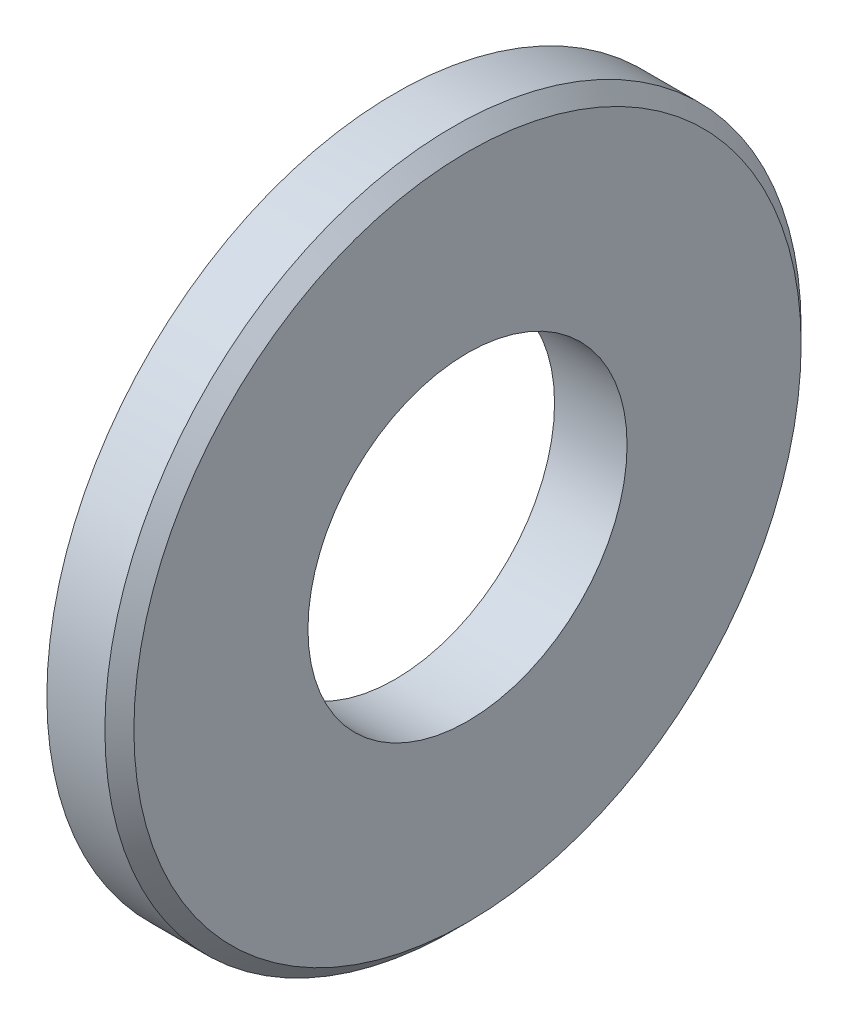
ISO-10303-21;
HEADER;
FILE_DESCRIPTION(('STEP AP214'),'2;1');
FILE_NAME('part.step','',(''),(''),'','','');
FILE_SCHEMA(('AUTOMOTIVE_DESIGN { 1 0 10303 214 1 1 1 1 }'));
ENDSEC;
DATA;
#1=APPLICATION_CONTEXT('core data for automotive mechanical design processes');
#2=APPLICATION_PROTOCOL_DEFINITION('international standard','automotive_design',2000,#1);
#3=PRODUCT_CONTEXT('',#1,'mechanical');
#4=PRODUCT('Part','Part','',(#3));
#5=PRODUCT_RELATED_PRODUCT_CATEGORY('part','',(#4));
#6=PRODUCT_DEFINITION_FORMATION('','',#4);
#7=PRODUCT_DEFINITION_CONTEXT('part definition',#1,'design');
#8=PRODUCT_DEFINITION('design','',#6,#7);
#9=PRODUCT_DEFINITION_SHAPE('','',#8);
#10=(LENGTH_UNIT() NAMED_UNIT(*) SI_UNIT(.MILLI.,.METRE.));
#11=(NAMED_UNIT(*) PLANE_ANGLE_UNIT() SI_UNIT($,.RADIAN.));
#12=(NAMED_UNIT(*) SI_UNIT($,.STERADIAN.) SOLID_ANGLE_UNIT());
#13=UNCERTAINTY_MEASURE_WITH_UNIT(LENGTH_MEASURE(1.E-05),#10,'distance_accuracy_value','');
#14=(GEOMETRIC_REPRESENTATION_CONTEXT(3) GLOBAL_UNCERTAINTY_ASSIGNED_CONTEXT((#13)) GLOBAL_UNIT_ASSIGNED_CONTEXT((#10,
#11,#12)) REPRESENTATION_CONTEXT('',''));
#15=CARTESIAN_POINT('',(0.,0.,0.));
#16=DIRECTION('',(0.,0.,1.));
#17=DIRECTION('',(1.,0.,0.));
#18=AXIS2_PLACEMENT_3D('',#15,#16,#17);
#19=CARTESIAN_POINT('',(2.,12.,0.));
#20=DIRECTION('',(1.,0.,0.));
#21=DIRECTION('',(0.,0.,-1.));
#22=AXIS2_PLACEMENT_3D('',#19,#20,#21);
#23=PLANE('',#22);
#24=CARTESIAN_POINT('',(2.,0.,0.));
#25=DIRECTION('',(-1.,0.,0.));
#26=DIRECTION('',(0.,0.,1.));
#27=AXIS2_PLACEMENT_3D('',#24,#25,#26);
#28=CIRCLE('',#27,12.);
#29=CARTESIAN_POINT('',(2.,0.,12.));
#30=VERTEX_POINT('',#29);
#31=EDGE_CURVE('E38',#30,#30,#28,.F.);
#32=ORIENTED_EDGE('',*,*,#31,.F.);
#33=EDGE_LOOP('',(#32));
#34=FACE_BOUND('',#33,.T.);
#35=CARTESIAN_POINT('',(2.,0.,0.));
#36=DIRECTION('',(-1.,0.,0.));
#37=DIRECTION('',(0.,0.,1.));
#38=AXIS2_PLACEMENT_3D('',#35,#36,#37);
#39=CIRCLE('',#38,10.25);
#40=CARTESIAN_POINT('',(2.,0.,10.25));
#41=VERTEX_POINT('',#40);
#42=EDGE_CURVE('E18',#41,#41,#39,.F.);
#43=ORIENTED_EDGE('',*,*,#42,.T.);
#44=EDGE_LOOP('',(#43));
#45=FACE_BOUND('',#44,.T.);
#46=ADVANCED_FACE('F15',(#34,#45),#23,.F.);
#47=CARTESIAN_POINT('',(0.,0.,0.));
#48=DIRECTION('',(-1.,0.,0.));
#49=DIRECTION('',(0.,0.,1.));
#50=AXIS2_PLACEMENT_3D('',#47,#48,#49);
#51=TOROIDAL_SURFACE('',#50,8.75,2.5);
#52=CARTESIAN_POINT('',(2.,0.,0.));
#53=DIRECTION('',(-1.,0.,0.));
#54=DIRECTION('',(0.,0.,1.));
#55=AXIS2_PLACEMENT_3D('',#52,#53,#54);
#56=CIRCLE('',#55,7.25);
#57=CARTESIAN_POINT('',(2.,0.,7.25));
#58=VERTEX_POINT('',#57);
#59=EDGE_CURVE('E36',#58,#58,#56,.F.);
#60=ORIENTED_EDGE('',*,*,#59,.T.);
#61=EDGE_LOOP('',(#60));
#62=FACE_BOUND('',#61,.T.);
#63=ORIENTED_EDGE('',*,*,#42,.F.);
#64=EDGE_LOOP('',(#63));
#65=FACE_BOUND('',#64,.T.);
#66=ADVANCED_FACE('F46',(#62,#65),#51,.F.);
#67=CARTESIAN_POINT('',(-4.5,0.,0.));
#68=DIRECTION('',(-1.,0.,0.));
#69=DIRECTION('',(0.,0.,1.));
#70=AXIS2_PLACEMENT_3D('',#67,#68,#69);
#71=CYLINDRICAL_SURFACE('',#70,12.);
#72=CARTESIAN_POINT('',(3.99999999999999,0.,0.));
#73=DIRECTION('',(-1.,0.,0.));
#74=DIRECTION('',(0.,0.,1.));
#75=AXIS2_PLACEMENT_3D('',#72,#73,#74);
#76=CIRCLE('',#75,12.);
#77=CARTESIAN_POINT('',(3.99999999999999,0.,12.));
#78=VERTEX_POINT('',#77);
#79=EDGE_CURVE('E35',#78,#78,#76,.F.);
#80=ORIENTED_EDGE('',*,*,#79,.F.);
#81=EDGE_LOOP('',(#80));
#82=FACE_BOUND('',#81,.T.);
#83=ORIENTED_EDGE('',*,*,#31,.T.);
#84=EDGE_LOOP('',(#83));
#85=FACE_BOUND('',#84,.T.);
#86=ADVANCED_FACE('F48',(#82,#85),#71,.T.);
#87=CARTESIAN_POINT('',(2.,7.25,0.));
#88=DIRECTION('',(1.,0.,0.));
#89=DIRECTION('',(0.,0.,-1.));
#90=AXIS2_PLACEMENT_3D('',#87,#88,#89);
#91=PLANE('',#90);
#92=ORIENTED_EDGE('',*,*,#59,.F.);
#93=EDGE_LOOP('',(#92));
#94=FACE_BOUND('',#93,.T.);
#95=CARTESIAN_POINT('',(2.,0.,0.));
#96=DIRECTION('',(-1.,0.,0.));
#97=DIRECTION('',(0.,0.,1.));
#98=AXIS2_PLACEMENT_3D('',#95,#96,#97);
#99=CIRCLE('',#98,5.5);
#100=CARTESIAN_POINT('',(2.,0.,5.5));
#101=VERTEX_POINT('',#100);
#102=EDGE_CURVE('E27',#101,#101,#99,.F.);
#103=ORIENTED_EDGE('',*,*,#102,.T.);
#104=EDGE_LOOP('',(#103));
#105=FACE_BOUND('',#104,.T.);
#106=ADVANCED_FACE('F55',(#94,#105),#91,.F.);
#107=CARTESIAN_POINT('',(3.99999999999999,0.,0.));
#108=DIRECTION('',(-1.,0.,0.));
#109=DIRECTION('',(0.,0.,1.));
#110=AXIS2_PLACEMENT_3D('',#107,#108,#109);
#111=CONICAL_SURFACE('',#110,12.,0.785398163397451);
#112=CARTESIAN_POINT('',(4.5,0.,0.));
#113=DIRECTION('',(-1.,0.,0.));
#114=DIRECTION('',(0.,0.,1.));
#115=AXIS2_PLACEMENT_3D('',#112,#113,#114);
#116=CIRCLE('',#115,11.5);
#117=CARTESIAN_POINT('',(4.5,0.,11.5));
#118=VERTEX_POINT('',#117);
#119=EDGE_CURVE('E22',#118,#118,#116,.T.);
#120=ORIENTED_EDGE('',*,*,#119,.T.);
#121=EDGE_LOOP('',(#120));
#122=FACE_BOUND('',#121,.T.);
#123=ORIENTED_EDGE('',*,*,#79,.T.);
#124=EDGE_LOOP('',(#123));
#125=FACE_BOUND('',#124,.T.);
#126=ADVANCED_FACE('F67',(#122,#125),#111,.T.);
#127=CARTESIAN_POINT('',(-4.5,0.,0.));
#128=DIRECTION('',(-1.,0.,0.));
#129=DIRECTION('',(0.,0.,1.));
#130=AXIS2_PLACEMENT_3D('',#127,#128,#129);
#131=CYLINDRICAL_SURFACE('',#130,5.5);
#132=CARTESIAN_POINT('',(4.5,0.,0.));
#133=DIRECTION('',(-1.,0.,0.));
#134=DIRECTION('',(0.,0.,1.));
#135=AXIS2_PLACEMENT_3D('',#132,#133,#134);
#136=CIRCLE('',#135,5.5);
#137=CARTESIAN_POINT('',(4.5,0.,5.5));
#138=VERTEX_POINT('',#137);
#139=EDGE_CURVE('E10',#138,#138,#136,.F.);
#140=ORIENTED_EDGE('',*,*,#139,.T.);
#141=EDGE_LOOP('',(#140));
#142=FACE_BOUND('',#141,.T.);
#143=ORIENTED_EDGE('',*,*,#102,.F.);
#144=EDGE_LOOP('',(#143));
#145=FACE_BOUND('',#144,.T.);
#146=ADVANCED_FACE('F61',(#142,#145),#131,.F.);
#147=CARTESIAN_POINT('',(4.5,5.5,0.));
#148=DIRECTION('',(-1.,0.,0.));
#149=DIRECTION('',(0.,0.,1.));
#150=AXIS2_PLACEMENT_3D('',#147,#148,#149);
#151=PLANE('',#150);
#152=ORIENTED_EDGE('',*,*,#139,.F.);
#153=EDGE_LOOP('',(#152));
#154=FACE_BOUND('',#153,.T.);
#155=ORIENTED_EDGE('',*,*,#119,.F.);
#156=EDGE_LOOP('',(#155));
#157=FACE_BOUND('',#156,.T.);
#158=ADVANCED_FACE('F59',(#154,#157),#151,.F.);
#159=CLOSED_SHELL('',(#46,#66,#86,#106,#126,#146,#158));
#160=MANIFOLD_SOLID_BREP('B1',#159);
#161=ADVANCED_BREP_SHAPE_REPRESENTATION('',(#18,#160),#14);
#162=SHAPE_DEFINITION_REPRESENTATION(#9,#161);
ENDSEC;
END-ISO-10303-21;
